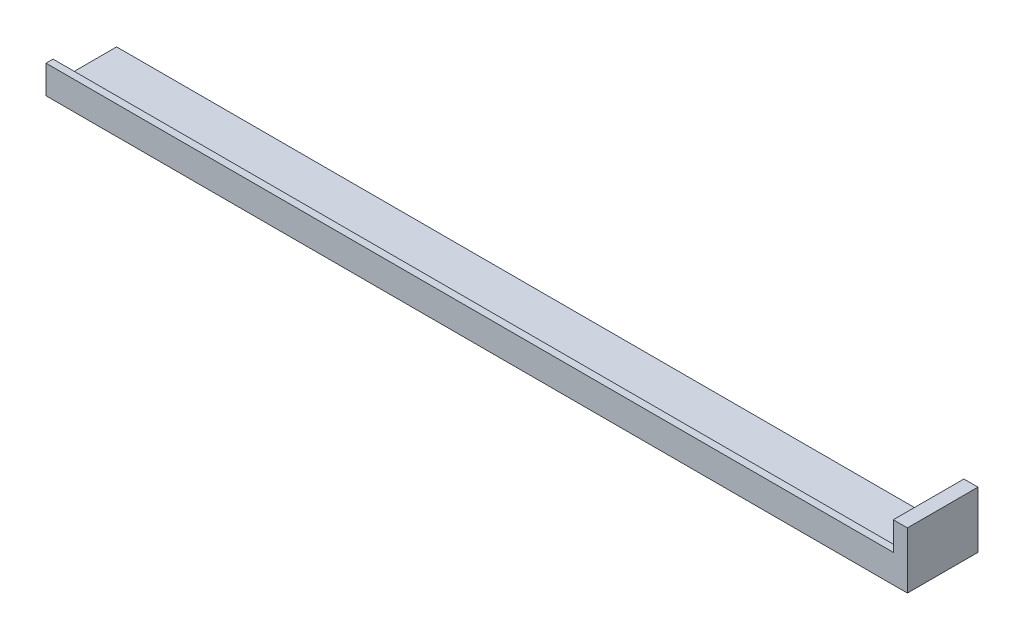
ISO-10303-21;
HEADER;
FILE_DESCRIPTION(('STEP AP214'),'2;1');
FILE_NAME('part.step','',(''),(''),'','','');
FILE_SCHEMA(('AUTOMOTIVE_DESIGN { 1 0 10303 214 1 1 1 1 }'));
ENDSEC;
DATA;
#1=APPLICATION_CONTEXT('core data for automotive mechanical design processes');
#2=APPLICATION_PROTOCOL_DEFINITION('international standard','automotive_design',2000,#1);
#3=PRODUCT_CONTEXT('',#1,'mechanical');
#4=PRODUCT('Part','Part','',(#3));
#5=PRODUCT_RELATED_PRODUCT_CATEGORY('part','',(#4));
#6=PRODUCT_DEFINITION_FORMATION('','',#4);
#7=PRODUCT_DEFINITION_CONTEXT('part definition',#1,'design');
#8=PRODUCT_DEFINITION('design','',#6,#7);
#9=PRODUCT_DEFINITION_SHAPE('','',#8);
#10=(LENGTH_UNIT() NAMED_UNIT(*) SI_UNIT(.MILLI.,.METRE.));
#11=(NAMED_UNIT(*) PLANE_ANGLE_UNIT() SI_UNIT($,.RADIAN.));
#12=(NAMED_UNIT(*) SI_UNIT($,.STERADIAN.) SOLID_ANGLE_UNIT());
#13=UNCERTAINTY_MEASURE_WITH_UNIT(LENGTH_MEASURE(1.E-05),#10,'distance_accuracy_value','');
#14=(GEOMETRIC_REPRESENTATION_CONTEXT(3) GLOBAL_UNCERTAINTY_ASSIGNED_CONTEXT((#13)) GLOBAL_UNIT_ASSIGNED_CONTEXT((#10,
#11,#12)) REPRESENTATION_CONTEXT('',''));
#15=CARTESIAN_POINT('',(0.,0.,0.));
#16=DIRECTION('',(0.,0.,1.));
#17=DIRECTION('',(1.,0.,0.));
#18=AXIS2_PLACEMENT_3D('',#15,#16,#17);
#19=CARTESIAN_POINT('',(0.,3.,10.));
#20=DIRECTION('',(0.,-1.,0.));
#21=DIRECTION('',(0.,0.,-1.));
#22=AXIS2_PLACEMENT_3D('',#19,#20,#21);
#23=PLANE('',#22);
#24=DIRECTION('',(0.,0.,1.));
#25=VECTOR('',#24,1.);
#26=CARTESIAN_POINT('',(0.,3.,0.));
#27=LINE('',#26,#25);
#28=CARTESIAN_POINT('',(0.,3.,9.));
#29=VERTEX_POINT('',#28);
#30=CARTESIAN_POINT('',(0.,3.,10.));
#31=VERTEX_POINT('',#30);
#32=EDGE_CURVE('E11',#29,#31,#27,.T.);
#33=ORIENTED_EDGE('',*,*,#32,.F.);
#34=DIRECTION('',(1.,0.,0.));
#35=VECTOR('',#34,1.);
#36=CARTESIAN_POINT('',(-120.,3.,9.));
#37=LINE('',#36,#35);
#38=CARTESIAN_POINT('',(-120.,3.,9.));
#39=VERTEX_POINT('',#38);
#40=EDGE_CURVE('E126',#39,#29,#37,.T.);
#41=ORIENTED_EDGE('',*,*,#40,.F.);
#42=DIRECTION('',(0.,0.,-1.));
#43=VECTOR('',#42,1.);
#44=CARTESIAN_POINT('',(-120.,3.,10.));
#45=LINE('',#44,#43);
#46=CARTESIAN_POINT('',(-120.,3.,10.));
#47=VERTEX_POINT('',#46);
#48=EDGE_CURVE('E123',#47,#39,#45,.T.);
#49=ORIENTED_EDGE('',*,*,#48,.F.);
#50=DIRECTION('',(-1.,0.,0.));
#51=VECTOR('',#50,1.);
#52=CARTESIAN_POINT('',(0.,3.,10.));
#53=LINE('',#52,#51);
#54=EDGE_CURVE('E88',#31,#47,#53,.T.);
#55=ORIENTED_EDGE('',*,*,#54,.F.);
#56=EDGE_LOOP('',(#33,#41,#49,#55));
#57=FACE_BOUND('',#56,.T.);
#58=ADVANCED_FACE('F32',(#57),#23,.F.);
#59=CARTESIAN_POINT('',(0.,0.,10.));
#60=DIRECTION('',(1.,0.,0.));
#61=DIRECTION('',(0.,0.,-1.));
#62=AXIS2_PLACEMENT_3D('',#59,#60,#61);
#63=PLANE('',#62);
#64=DIRECTION('',(0.,-1.,0.));
#65=VECTOR('',#64,1.);
#66=CARTESIAN_POINT('',(0.,123.004166594331,9.));
#67=LINE('',#66,#65);
#68=CARTESIAN_POINT('',(0.,0.,9.));
#69=VERTEX_POINT('',#68);
#70=EDGE_CURVE('E135',#29,#69,#67,.T.);
#71=ORIENTED_EDGE('',*,*,#70,.F.);
#72=ORIENTED_EDGE('',*,*,#32,.T.);
#73=DIRECTION('',(0.,-1.,0.));
#74=VECTOR('',#73,1.);
#75=CARTESIAN_POINT('',(0.,7.,10.));
#76=LINE('',#75,#74);
#77=CARTESIAN_POINT('',(0.,7.,10.));
#78=VERTEX_POINT('',#77);
#79=EDGE_CURVE('E140',#78,#31,#76,.T.);
#80=ORIENTED_EDGE('',*,*,#79,.F.);
#81=DIRECTION('',(0.,0.,1.));
#82=VECTOR('',#81,1.);
#83=CARTESIAN_POINT('',(0.,7.,0.));
#84=LINE('',#83,#82);
#85=CARTESIAN_POINT('',(0.,7.,0.));
#86=VERTEX_POINT('',#85);
#87=EDGE_CURVE('E122',#86,#78,#84,.T.);
#88=ORIENTED_EDGE('',*,*,#87,.F.);
#89=DIRECTION('',(0.,-1.,0.));
#90=VECTOR('',#89,1.);
#91=CARTESIAN_POINT('',(0.,0.,0.));
#92=LINE('',#91,#90);
#93=CARTESIAN_POINT('',(0.,0.,0.));
#94=VERTEX_POINT('',#93);
#95=EDGE_CURVE('E117',#86,#94,#92,.T.);
#96=ORIENTED_EDGE('',*,*,#95,.T.);
#97=DIRECTION('',(0.,0.,-1.));
#98=VECTOR('',#97,1.);
#99=CARTESIAN_POINT('',(0.,0.,10.));
#100=LINE('',#99,#98);
#101=EDGE_CURVE('E36',#69,#94,#100,.T.);
#102=ORIENTED_EDGE('',*,*,#101,.F.);
#103=EDGE_LOOP('',(#71,#72,#80,#88,#96,#102));
#104=FACE_BOUND('',#103,.T.);
#105=ADVANCED_FACE('F34',(#104),#63,.F.);
#106=CARTESIAN_POINT('',(0.,0.,10.));
#107=DIRECTION('',(0.,-1.,0.));
#108=DIRECTION('',(0.,0.,-1.));
#109=AXIS2_PLACEMENT_3D('',#106,#107,#108);
#110=PLANE('',#109);
#111=DIRECTION('',(-1.,0.,0.));
#112=VECTOR('',#111,1.);
#113=CARTESIAN_POINT('',(-120.,0.,9.));
#114=LINE('',#113,#112);
#115=CARTESIAN_POINT('',(-120.,0.,9.));
#116=VERTEX_POINT('',#115);
#117=EDGE_CURVE('E112',#69,#116,#114,.T.);
#118=ORIENTED_EDGE('',*,*,#117,.F.);
#119=ORIENTED_EDGE('',*,*,#101,.T.);
#120=DIRECTION('',(-1.,0.,0.));
#121=VECTOR('',#120,1.);
#122=CARTESIAN_POINT('',(0.,0.,0.));
#123=LINE('',#122,#121);
#124=CARTESIAN_POINT('',(-120.,0.,0.));
#125=VERTEX_POINT('',#124);
#126=EDGE_CURVE('E109',#94,#125,#123,.T.);
#127=ORIENTED_EDGE('',*,*,#126,.T.);
#128=DIRECTION('',(0.,0.,-1.));
#129=VECTOR('',#128,1.);
#130=CARTESIAN_POINT('',(-120.,0.,10.));
#131=LINE('',#130,#129);
#132=EDGE_CURVE('E100',#116,#125,#131,.T.);
#133=ORIENTED_EDGE('',*,*,#132,.F.);
#134=EDGE_LOOP('',(#118,#119,#127,#133));
#135=FACE_BOUND('',#134,.T.);
#136=ADVANCED_FACE('F108',(#135),#110,.F.);
#137=CARTESIAN_POINT('',(-120.,0.,10.));
#138=DIRECTION('',(1.,0.,0.));
#139=DIRECTION('',(0.,0.,-1.));
#140=AXIS2_PLACEMENT_3D('',#137,#138,#139);
#141=PLANE('',#140);
#142=DIRECTION('',(0.,-1.,0.));
#143=VECTOR('',#142,1.);
#144=CARTESIAN_POINT('',(-120.,0.,0.));
#145=LINE('',#144,#143);
#146=CARTESIAN_POINT('',(-120.,-1.,0.));
#147=VERTEX_POINT('',#146);
#148=EDGE_CURVE('E66',#125,#147,#145,.T.);
#149=ORIENTED_EDGE('',*,*,#148,.T.);
#150=DIRECTION('',(0.,0.,-1.));
#151=VECTOR('',#150,1.);
#152=CARTESIAN_POINT('',(-120.,-1.,10.));
#153=LINE('',#152,#151);
#154=CARTESIAN_POINT('',(-120.,-1.,10.));
#155=VERTEX_POINT('',#154);
#156=EDGE_CURVE('E76',#155,#147,#153,.T.);
#157=ORIENTED_EDGE('',*,*,#156,.F.);
#158=DIRECTION('',(0.,-1.,0.));
#159=VECTOR('',#158,1.);
#160=CARTESIAN_POINT('',(-120.,0.,10.));
#161=LINE('',#160,#159);
#162=EDGE_CURVE('E95',#47,#155,#161,.T.);
#163=ORIENTED_EDGE('',*,*,#162,.F.);
#164=ORIENTED_EDGE('',*,*,#48,.T.);
#165=DIRECTION('',(0.,-1.,0.));
#166=VECTOR('',#165,1.);
#167=CARTESIAN_POINT('',(-120.,123.004166594331,9.));
#168=LINE('',#167,#166);
#169=EDGE_CURVE('E138',#39,#116,#168,.T.);
#170=ORIENTED_EDGE('',*,*,#169,.T.);
#171=ORIENTED_EDGE('',*,*,#132,.T.);
#172=EDGE_LOOP('',(#149,#157,#163,#164,#170,#171));
#173=FACE_BOUND('',#172,.T.);
#174=ADVANCED_FACE('F176',(#173),#141,.F.);
#175=CARTESIAN_POINT('',(2.,-1.,10.));
#176=DIRECTION('',(0.,1.,0.));
#177=DIRECTION('',(0.,0.,1.));
#178=AXIS2_PLACEMENT_3D('',#175,#176,#177);
#179=PLANE('',#178);
#180=DIRECTION('',(1.,0.,0.));
#181=VECTOR('',#180,1.);
#182=CARTESIAN_POINT('',(2.,-1.,0.));
#183=LINE('',#182,#181);
#184=CARTESIAN_POINT('',(2.,-1.,0.));
#185=VERTEX_POINT('',#184);
#186=EDGE_CURVE('E71',#147,#185,#183,.T.);
#187=ORIENTED_EDGE('',*,*,#186,.T.);
#188=DIRECTION('',(0.,0.,-1.));
#189=VECTOR('',#188,1.);
#190=CARTESIAN_POINT('',(2.,-1.,10.));
#191=LINE('',#190,#189);
#192=CARTESIAN_POINT('',(2.,-1.,10.));
#193=VERTEX_POINT('',#192);
#194=EDGE_CURVE('E74',#193,#185,#191,.T.);
#195=ORIENTED_EDGE('',*,*,#194,.F.);
#196=DIRECTION('',(1.,0.,0.));
#197=VECTOR('',#196,1.);
#198=CARTESIAN_POINT('',(2.,-1.,10.));
#199=LINE('',#198,#197);
#200=EDGE_CURVE('E50',#155,#193,#199,.T.);
#201=ORIENTED_EDGE('',*,*,#200,.F.);
#202=ORIENTED_EDGE('',*,*,#156,.T.);
#203=EDGE_LOOP('',(#187,#195,#201,#202));
#204=FACE_BOUND('',#203,.T.);
#205=ADVANCED_FACE('F73',(#204),#179,.F.);
#206=CARTESIAN_POINT('',(2.,3.,10.));
#207=DIRECTION('',(-1.,0.,0.));
#208=DIRECTION('',(0.,0.,1.));
#209=AXIS2_PLACEMENT_3D('',#206,#207,#208);
#210=PLANE('',#209);
#211=DIRECTION('',(0.,1.,0.));
#212=VECTOR('',#211,1.);
#213=CARTESIAN_POINT('',(2.,3.,0.));
#214=LINE('',#213,#212);
#215=CARTESIAN_POINT('',(2.,7.,0.));
#216=VERTEX_POINT('',#215);
#217=EDGE_CURVE('E79',#185,#216,#214,.T.);
#218=ORIENTED_EDGE('',*,*,#217,.T.);
#219=DIRECTION('',(0.,0.,-1.));
#220=VECTOR('',#219,1.);
#221=CARTESIAN_POINT('',(2.,7.,0.));
#222=LINE('',#221,#220);
#223=CARTESIAN_POINT('',(2.,7.,10.));
#224=VERTEX_POINT('',#223);
#225=EDGE_CURVE('E145',#224,#216,#222,.T.);
#226=ORIENTED_EDGE('',*,*,#225,.F.);
#227=DIRECTION('',(0.,1.,0.));
#228=VECTOR('',#227,1.);
#229=CARTESIAN_POINT('',(2.,3.,10.));
#230=LINE('',#229,#228);
#231=EDGE_CURVE('E87',#193,#224,#230,.T.);
#232=ORIENTED_EDGE('',*,*,#231,.F.);
#233=ORIENTED_EDGE('',*,*,#194,.T.);
#234=EDGE_LOOP('',(#218,#226,#232,#233));
#235=FACE_BOUND('',#234,.T.);
#236=ADVANCED_FACE('F83',(#235),#210,.F.);
#237=CARTESIAN_POINT('',(0.,0.,10.));
#238=DIRECTION('',(0.,0.,-1.));
#239=DIRECTION('',(-1.,0.,0.));
#240=AXIS2_PLACEMENT_3D('',#237,#238,#239);
#241=PLANE('',#240);
#242=ORIENTED_EDGE('',*,*,#231,.T.);
#243=DIRECTION('',(1.,0.,0.));
#244=VECTOR('',#243,1.);
#245=CARTESIAN_POINT('',(0.,7.,10.));
#246=LINE('',#245,#244);
#247=EDGE_CURVE('E147',#78,#224,#246,.T.);
#248=ORIENTED_EDGE('',*,*,#247,.F.);
#249=ORIENTED_EDGE('',*,*,#79,.T.);
#250=ORIENTED_EDGE('',*,*,#54,.T.);
#251=ORIENTED_EDGE('',*,*,#162,.T.);
#252=ORIENTED_EDGE('',*,*,#200,.T.);
#253=EDGE_LOOP('',(#242,#248,#249,#250,#251,#252));
#254=FACE_BOUND('',#253,.T.);
#255=ADVANCED_FACE('F158',(#254),#241,.F.);
#256=CARTESIAN_POINT('',(0.,0.,0.));
#257=DIRECTION('',(0.,0.,-1.));
#258=DIRECTION('',(-1.,0.,0.));
#259=AXIS2_PLACEMENT_3D('',#256,#257,#258);
#260=PLANE('',#259);
#261=ORIENTED_EDGE('',*,*,#95,.F.);
#262=DIRECTION('',(-1.,0.,0.));
#263=VECTOR('',#262,1.);
#264=CARTESIAN_POINT('',(0.,7.,0.));
#265=LINE('',#264,#263);
#266=EDGE_CURVE('E94',#216,#86,#265,.T.);
#267=ORIENTED_EDGE('',*,*,#266,.F.);
#268=ORIENTED_EDGE('',*,*,#217,.F.);
#269=ORIENTED_EDGE('',*,*,#186,.F.);
#270=ORIENTED_EDGE('',*,*,#148,.F.);
#271=ORIENTED_EDGE('',*,*,#126,.F.);
#272=EDGE_LOOP('',(#261,#267,#268,#269,#270,#271));
#273=FACE_BOUND('',#272,.T.);
#274=ADVANCED_FACE('F92',(#273),#260,.T.);
#275=CARTESIAN_POINT('',(-120.,123.004166594331,9.));
#276=DIRECTION('',(0.,0.,1.));
#277=DIRECTION('',(1.,0.,0.));
#278=AXIS2_PLACEMENT_3D('',#275,#276,#277);
#279=PLANE('',#278);
#280=ORIENTED_EDGE('',*,*,#169,.F.);
#281=ORIENTED_EDGE('',*,*,#40,.T.);
#282=ORIENTED_EDGE('',*,*,#70,.T.);
#283=ORIENTED_EDGE('',*,*,#117,.T.);
#284=EDGE_LOOP('',(#280,#281,#282,#283));
#285=FACE_BOUND('',#284,.T.);
#286=ADVANCED_FACE('F177',(#285),#279,.F.);
#287=CARTESIAN_POINT('',(0.,7.,0.));
#288=DIRECTION('',(0.,1.,0.));
#289=DIRECTION('',(0.,0.,1.));
#290=AXIS2_PLACEMENT_3D('',#287,#288,#289);
#291=PLANE('',#290);
#292=ORIENTED_EDGE('',*,*,#87,.T.);
#293=ORIENTED_EDGE('',*,*,#247,.T.);
#294=ORIENTED_EDGE('',*,*,#225,.T.);
#295=ORIENTED_EDGE('',*,*,#266,.T.);
#296=EDGE_LOOP('',(#292,#293,#294,#295));
#297=FACE_BOUND('',#296,.T.);
#298=ADVANCED_FACE('F152',(#297),#291,.T.);
#299=CLOSED_SHELL('',(#58,#105,#136,#174,#205,#236,#255,#274,#286,#298));
#300=MANIFOLD_SOLID_BREP('B2',#299);
#301=ADVANCED_BREP_SHAPE_REPRESENTATION('',(#18,#300),#14);
#302=SHAPE_DEFINITION_REPRESENTATION(#9,#301);
ENDSEC;
END-ISO-10303-21;
